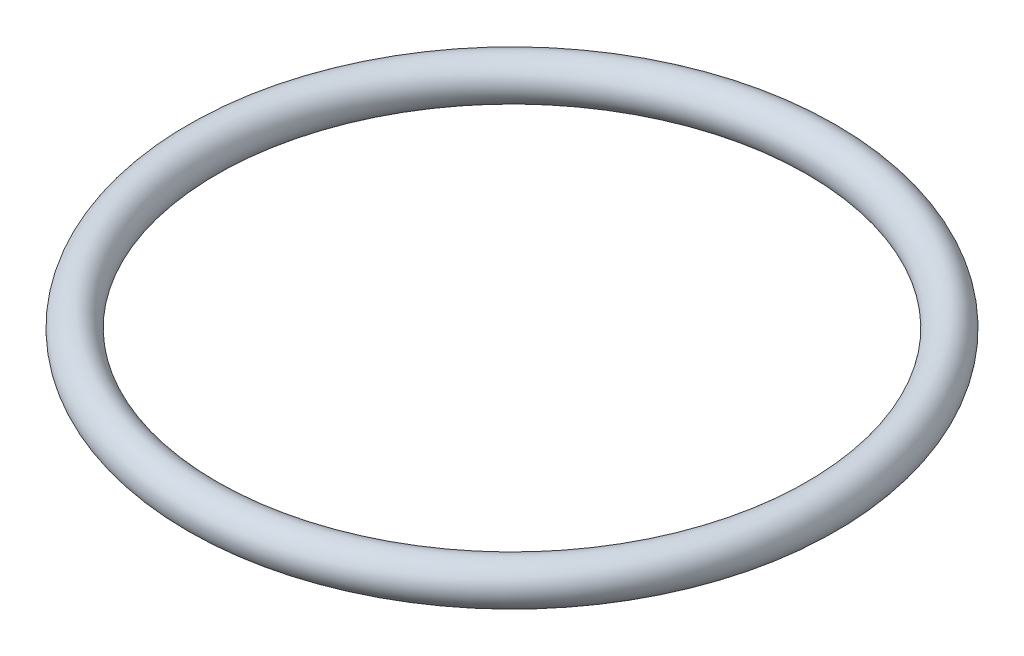
ISO-10303-21;
HEADER;
FILE_DESCRIPTION(('STEP AP214'),'2;1');
FILE_NAME('part.step','',(''),(''),'','','');
FILE_SCHEMA(('AUTOMOTIVE_DESIGN { 1 0 10303 214 1 1 1 1 }'));
ENDSEC;
DATA;
#1=APPLICATION_CONTEXT('core data for automotive mechanical design processes');
#2=APPLICATION_PROTOCOL_DEFINITION('international standard','automotive_design',2000,#1);
#3=PRODUCT_CONTEXT('',#1,'mechanical');
#4=PRODUCT('Part','Part','',(#3));
#5=PRODUCT_RELATED_PRODUCT_CATEGORY('part','',(#4));
#6=PRODUCT_DEFINITION_FORMATION('','',#4);
#7=PRODUCT_DEFINITION_CONTEXT('part definition',#1,'design');
#8=PRODUCT_DEFINITION('design','',#6,#7);
#9=PRODUCT_DEFINITION_SHAPE('','',#8);
#10=(LENGTH_UNIT() NAMED_UNIT(*) SI_UNIT(.MILLI.,.METRE.));
#11=(NAMED_UNIT(*) PLANE_ANGLE_UNIT() SI_UNIT($,.RADIAN.));
#12=(NAMED_UNIT(*) SI_UNIT($,.STERADIAN.) SOLID_ANGLE_UNIT());
#13=UNCERTAINTY_MEASURE_WITH_UNIT(LENGTH_MEASURE(1.E-05),#10,'distance_accuracy_value','');
#14=(GEOMETRIC_REPRESENTATION_CONTEXT(3) GLOBAL_UNCERTAINTY_ASSIGNED_CONTEXT((#13)) GLOBAL_UNIT_ASSIGNED_CONTEXT((#10,
#11,#12)) REPRESENTATION_CONTEXT('',''));
#15=CARTESIAN_POINT('',(0.,0.,0.));
#16=DIRECTION('',(0.,0.,1.));
#17=DIRECTION('',(1.,0.,0.));
#18=AXIS2_PLACEMENT_3D('',#15,#16,#17);
#19=CARTESIAN_POINT('',(0.,0.,0.));
#20=DIRECTION('',(0.,-1.,0.));
#21=DIRECTION('',(0.,0.,-1.));
#22=AXIS2_PLACEMENT_3D('',#19,#20,#21);
#23=TOROIDAL_SURFACE('',#22,107.,7.);
#24=CARTESIAN_POINT('',(0.,0.,-114.));
#25=VERTEX_POINT('',#24);
#26=VERTEX_LOOP('',#25);
#27=FACE_BOUND('',#26,.T.);
#28=ADVANCED_FACE('F31',(#27),#23,.T.);
#29=CLOSED_SHELL('',(#28));
#30=MANIFOLD_SOLID_BREP('B2',#29);
#31=ADVANCED_BREP_SHAPE_REPRESENTATION('',(#18,#30),#14);
#32=SHAPE_DEFINITION_REPRESENTATION(#9,#31);
ENDSEC;
END-ISO-10303-21;
